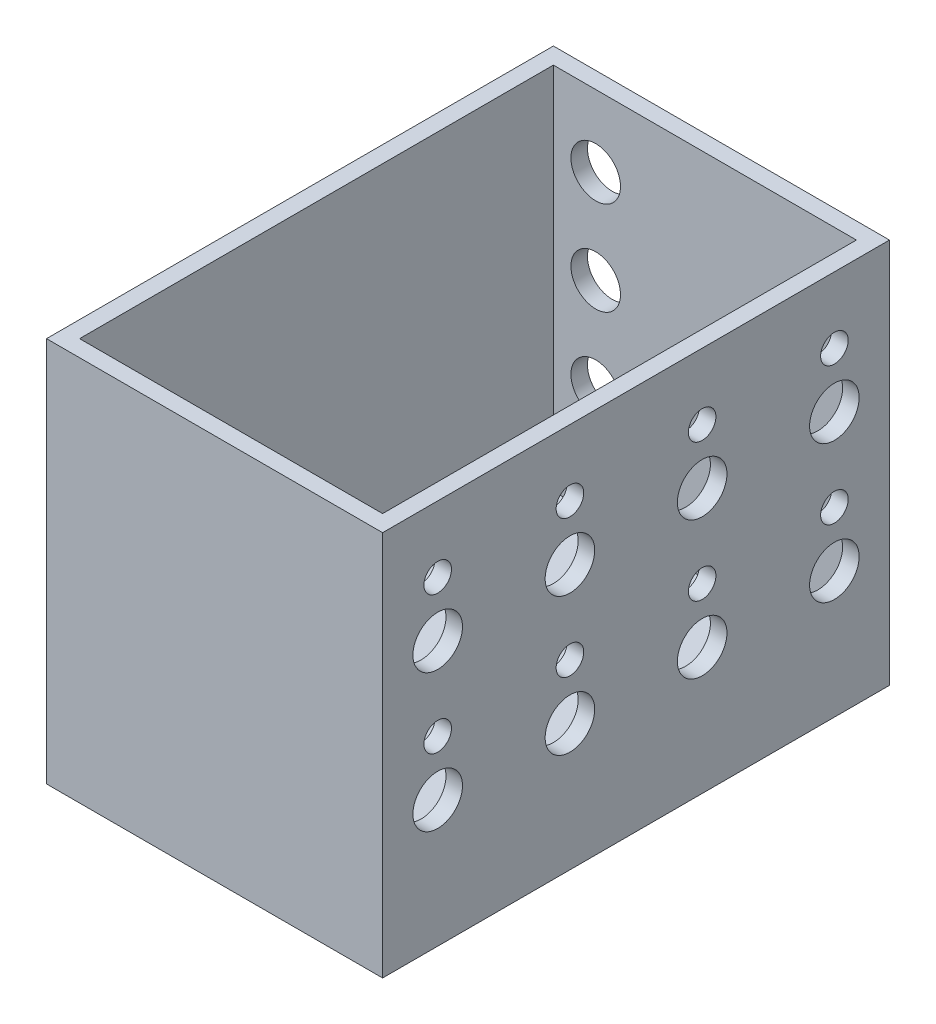
ISO-10303-21;
HEADER;
FILE_DESCRIPTION(('STEP AP214'),'2;1');
FILE_NAME('part.step','',(''),(''),'','','');
FILE_SCHEMA(('AUTOMOTIVE_DESIGN { 1 0 10303 214 1 1 1 1 }'));
ENDSEC;
DATA;
#1=APPLICATION_CONTEXT('core data for automotive mechanical design processes');
#2=APPLICATION_PROTOCOL_DEFINITION('international standard','automotive_design',2000,#1);
#3=PRODUCT_CONTEXT('',#1,'mechanical');
#4=PRODUCT('Part','Part','',(#3));
#5=PRODUCT_RELATED_PRODUCT_CATEGORY('part','',(#4));
#6=PRODUCT_DEFINITION_FORMATION('','',#4);
#7=PRODUCT_DEFINITION_CONTEXT('part definition',#1,'design');
#8=PRODUCT_DEFINITION('design','',#6,#7);
#9=PRODUCT_DEFINITION_SHAPE('','',#8);
#10=(LENGTH_UNIT() NAMED_UNIT(*) SI_UNIT(.MILLI.,.METRE.));
#11=(NAMED_UNIT(*) PLANE_ANGLE_UNIT() SI_UNIT($,.RADIAN.));
#12=(NAMED_UNIT(*) SI_UNIT($,.STERADIAN.) SOLID_ANGLE_UNIT());
#13=UNCERTAINTY_MEASURE_WITH_UNIT(LENGTH_MEASURE(1.E-05),#10,'distance_accuracy_value','');
#14=(GEOMETRIC_REPRESENTATION_CONTEXT(3) GLOBAL_UNCERTAINTY_ASSIGNED_CONTEXT((#13)) GLOBAL_UNIT_ASSIGNED_CONTEXT((#10,
#11,#12)) REPRESENTATION_CONTEXT('',''));
#15=CARTESIAN_POINT('',(0.,0.,0.));
#16=DIRECTION('',(0.,0.,1.));
#17=DIRECTION('',(1.,0.,0.));
#18=AXIS2_PLACEMENT_3D('',#15,#16,#17);
#19=CARTESIAN_POINT('',(0.,3.,0.));
#20=DIRECTION('',(0.,-1.,0.));
#21=DIRECTION('',(0.,0.,-1.));
#22=AXIS2_PLACEMENT_3D('',#19,#20,#21);
#23=PLANE('',#22);
#24=DIRECTION('',(-1.,0.,0.));
#25=VECTOR('',#24,1.);
#26=CARTESIAN_POINT('',(-22.5,3.,-22.5));
#27=LINE('',#26,#25);
#28=CARTESIAN_POINT('',(22.5,3.,-22.5));
#29=VERTEX_POINT('',#28);
#30=CARTESIAN_POINT('',(-22.5,3.,-22.5));
#31=VERTEX_POINT('',#30);
#32=EDGE_CURVE('E236',#29,#31,#27,.T.);
#33=ORIENTED_EDGE('',*,*,#32,.F.);
#34=DIRECTION('',(0.,0.,-1.));
#35=VECTOR('',#34,1.);
#36=CARTESIAN_POINT('',(22.5,3.,22.5));
#37=LINE('',#36,#35);
#38=CARTESIAN_POINT('',(22.5,3.,22.5));
#39=VERTEX_POINT('',#38);
#40=EDGE_CURVE('E59',#39,#29,#37,.T.);
#41=ORIENTED_EDGE('',*,*,#40,.F.);
#42=DIRECTION('',(1.,0.,0.));
#43=VECTOR('',#42,1.);
#44=CARTESIAN_POINT('',(-22.5,3.,22.5));
#45=LINE('',#44,#43);
#46=CARTESIAN_POINT('',(-22.5,3.,22.5));
#47=VERTEX_POINT('',#46);
#48=EDGE_CURVE('E221',#47,#39,#45,.T.);
#49=ORIENTED_EDGE('',*,*,#48,.F.);
#50=DIRECTION('',(0.,0.,1.));
#51=VECTOR('',#50,1.);
#52=CARTESIAN_POINT('',(-22.5,3.,22.5));
#53=LINE('',#52,#51);
#54=EDGE_CURVE('E240',#31,#47,#53,.T.);
#55=ORIENTED_EDGE('',*,*,#54,.F.);
#56=EDGE_LOOP('',(#33,#41,#49,#55));
#57=FACE_BOUND('',#56,.T.);
#58=DIRECTION('',(0.,0.,-1.));
#59=VECTOR('',#58,1.);
#60=CARTESIAN_POINT('',(27.5,3.,43.));
#61=LINE('',#60,#59);
#62=CARTESIAN_POINT('',(27.5,3.,43.));
#63=VERTEX_POINT('',#62);
#64=CARTESIAN_POINT('',(27.5,3.,-43.));
#65=VERTEX_POINT('',#64);
#66=EDGE_CURVE('E250',#63,#65,#61,.T.);
#67=ORIENTED_EDGE('',*,*,#66,.T.);
#68=DIRECTION('',(-1.,0.,0.));
#69=VECTOR('',#68,1.);
#70=CARTESIAN_POINT('',(-27.5,3.,-43.));
#71=LINE('',#70,#69);
#72=CARTESIAN_POINT('',(-27.5,3.,-43.));
#73=VERTEX_POINT('',#72);
#74=EDGE_CURVE('E262',#65,#73,#71,.T.);
#75=ORIENTED_EDGE('',*,*,#74,.T.);
#76=DIRECTION('',(0.,0.,1.));
#77=VECTOR('',#76,1.);
#78=CARTESIAN_POINT('',(-27.5,3.,43.));
#79=LINE('',#78,#77);
#80=CARTESIAN_POINT('',(-27.5,3.,43.));
#81=VERTEX_POINT('',#80);
#82=EDGE_CURVE('E52',#73,#81,#79,.T.);
#83=ORIENTED_EDGE('',*,*,#82,.T.);
#84=DIRECTION('',(1.,0.,0.));
#85=VECTOR('',#84,1.);
#86=CARTESIAN_POINT('',(-27.5,3.,43.));
#87=LINE('',#86,#85);
#88=EDGE_CURVE('E11',#81,#63,#87,.T.);
#89=ORIENTED_EDGE('',*,*,#88,.T.);
#90=EDGE_LOOP('',(#67,#75,#83,#89));
#91=FACE_BOUND('',#90,.T.);
#92=ADVANCED_FACE('F43',(#57,#91),#23,.F.);
#93=CARTESIAN_POINT('',(22.5,1.5,22.5));
#94=DIRECTION('',(1.,0.,0.));
#95=DIRECTION('',(0.,0.,-1.));
#96=AXIS2_PLACEMENT_3D('',#93,#94,#95);
#97=PLANE('',#96);
#98=ORIENTED_EDGE('',*,*,#40,.T.);
#99=DIRECTION('',(0.,1.,0.));
#100=VECTOR('',#99,1.);
#101=CARTESIAN_POINT('',(22.5,1.5,-22.5));
#102=LINE('',#101,#100);
#103=CARTESIAN_POINT('',(22.5,1.5,-22.5));
#104=VERTEX_POINT('',#103);
#105=EDGE_CURVE('E233',#104,#29,#102,.T.);
#106=ORIENTED_EDGE('',*,*,#105,.F.);
#107=DIRECTION('',(0.,0.,-1.));
#108=VECTOR('',#107,1.);
#109=CARTESIAN_POINT('',(22.5,1.5,22.5));
#110=LINE('',#109,#108);
#111=CARTESIAN_POINT('',(22.5,1.5,22.5));
#112=VERTEX_POINT('',#111);
#113=EDGE_CURVE('E216',#112,#104,#110,.T.);
#114=ORIENTED_EDGE('',*,*,#113,.F.);
#115=DIRECTION('',(0.,1.,0.));
#116=VECTOR('',#115,1.);
#117=CARTESIAN_POINT('',(22.5,1.5,22.5));
#118=LINE('',#117,#116);
#119=EDGE_CURVE('E247',#112,#39,#118,.T.);
#120=ORIENTED_EDGE('',*,*,#119,.T.);
#121=EDGE_LOOP('',(#98,#106,#114,#120));
#122=FACE_BOUND('',#121,.T.);
#123=ADVANCED_FACE('F279',(#122),#97,.F.);
#124=CARTESIAN_POINT('',(-22.5,1.5,22.5));
#125=DIRECTION('',(0.,0.,1.));
#126=DIRECTION('',(1.,0.,0.));
#127=AXIS2_PLACEMENT_3D('',#124,#125,#126);
#128=PLANE('',#127);
#129=ORIENTED_EDGE('',*,*,#48,.T.);
#130=ORIENTED_EDGE('',*,*,#119,.F.);
#131=DIRECTION('',(1.,0.,0.));
#132=VECTOR('',#131,1.);
#133=CARTESIAN_POINT('',(-22.5,1.5,22.5));
#134=LINE('',#133,#132);
#135=CARTESIAN_POINT('',(-22.5,1.5,22.5));
#136=VERTEX_POINT('',#135);
#137=EDGE_CURVE('E229',#136,#112,#134,.T.);
#138=ORIENTED_EDGE('',*,*,#137,.F.);
#139=DIRECTION('',(0.,1.,0.));
#140=VECTOR('',#139,1.);
#141=CARTESIAN_POINT('',(-22.5,1.5,22.5));
#142=LINE('',#141,#140);
#143=EDGE_CURVE('E251',#136,#47,#142,.T.);
#144=ORIENTED_EDGE('',*,*,#143,.T.);
#145=EDGE_LOOP('',(#129,#130,#138,#144));
#146=FACE_BOUND('',#145,.T.);
#147=ADVANCED_FACE('F284',(#146),#128,.F.);
#148=CARTESIAN_POINT('',(-22.5,1.5,22.5));
#149=DIRECTION('',(-1.,0.,0.));
#150=DIRECTION('',(0.,0.,1.));
#151=AXIS2_PLACEMENT_3D('',#148,#149,#150);
#152=PLANE('',#151);
#153=ORIENTED_EDGE('',*,*,#54,.T.);
#154=ORIENTED_EDGE('',*,*,#143,.F.);
#155=DIRECTION('',(0.,0.,1.));
#156=VECTOR('',#155,1.);
#157=CARTESIAN_POINT('',(-22.5,1.5,22.5));
#158=LINE('',#157,#156);
#159=CARTESIAN_POINT('',(-22.5,1.5,-22.5));
#160=VERTEX_POINT('',#159);
#161=EDGE_CURVE('E225',#160,#136,#158,.T.);
#162=ORIENTED_EDGE('',*,*,#161,.F.);
#163=DIRECTION('',(0.,1.,0.));
#164=VECTOR('',#163,1.);
#165=CARTESIAN_POINT('',(-22.5,1.5,-22.5));
#166=LINE('',#165,#164);
#167=EDGE_CURVE('E254',#160,#31,#166,.T.);
#168=ORIENTED_EDGE('',*,*,#167,.T.);
#169=EDGE_LOOP('',(#153,#154,#162,#168));
#170=FACE_BOUND('',#169,.T.);
#171=ADVANCED_FACE('F292',(#170),#152,.F.);
#172=CARTESIAN_POINT('',(-22.5,1.5,-22.5));
#173=DIRECTION('',(0.,0.,-1.));
#174=DIRECTION('',(-1.,0.,0.));
#175=AXIS2_PLACEMENT_3D('',#172,#173,#174);
#176=PLANE('',#175);
#177=ORIENTED_EDGE('',*,*,#32,.T.);
#178=ORIENTED_EDGE('',*,*,#167,.F.);
#179=DIRECTION('',(-1.,0.,0.));
#180=VECTOR('',#179,1.);
#181=CARTESIAN_POINT('',(-22.5,1.5,-22.5));
#182=LINE('',#181,#180);
#183=EDGE_CURVE('E220',#104,#160,#182,.T.);
#184=ORIENTED_EDGE('',*,*,#183,.F.);
#185=ORIENTED_EDGE('',*,*,#105,.T.);
#186=EDGE_LOOP('',(#177,#178,#184,#185));
#187=FACE_BOUND('',#186,.T.);
#188=ADVANCED_FACE('F288',(#187),#176,.F.);
#189=CARTESIAN_POINT('',(0.,1.5,0.));
#190=DIRECTION('',(0.,-1.,0.));
#191=DIRECTION('',(0.,0.,-1.));
#192=AXIS2_PLACEMENT_3D('',#189,#190,#191);
#193=PLANE('',#192);
#194=ORIENTED_EDGE('',*,*,#113,.T.);
#195=ORIENTED_EDGE('',*,*,#183,.T.);
#196=ORIENTED_EDGE('',*,*,#161,.T.);
#197=ORIENTED_EDGE('',*,*,#137,.T.);
#198=EDGE_LOOP('',(#194,#195,#196,#197));
#199=FACE_BOUND('',#198,.T.);
#200=ADVANCED_FACE('F291',(#199),#193,.F.);
#201=CARTESIAN_POINT('',(27.5,70.,-43.));
#202=DIRECTION('',(0.,0.,1.));
#203=DIRECTION('',(1.,0.,0.));
#204=AXIS2_PLACEMENT_3D('',#201,#202,#203);
#205=PLANE('',#204);
#206=CARTESIAN_POINT('',(-19.8186408341999,57.,-43.));
#207=DIRECTION('',(0.,0.,-1.));
#208=DIRECTION('',(-1.,0.,0.));
#209=AXIS2_PLACEMENT_3D('',#206,#207,#208);
#210=CIRCLE('',#209,4.5);
#211=CARTESIAN_POINT('',(-24.3186408341999,57.,-43.));
#212=VERTEX_POINT('',#211);
#213=EDGE_CURVE('E329',#212,#212,#210,.T.);
#214=ORIENTED_EDGE('',*,*,#213,.T.);
#215=EDGE_LOOP('',(#214));
#216=FACE_BOUND('',#215,.T.);
#217=CARTESIAN_POINT('',(-19.8186408341999,23.,-43.));
#218=DIRECTION('',(0.,0.,-1.));
#219=DIRECTION('',(-1.,0.,0.));
#220=AXIS2_PLACEMENT_3D('',#217,#218,#219);
#221=CIRCLE('',#220,4.5);
#222=CARTESIAN_POINT('',(-24.3186408341999,23.,-43.));
#223=VERTEX_POINT('',#222);
#224=EDGE_CURVE('E333',#223,#223,#221,.T.);
#225=ORIENTED_EDGE('',*,*,#224,.T.);
#226=EDGE_LOOP('',(#225));
#227=FACE_BOUND('',#226,.T.);
#228=CARTESIAN_POINT('',(-19.8186408341999,40.,-43.));
#229=DIRECTION('',(0.,0.,-1.));
#230=DIRECTION('',(-1.,0.,0.));
#231=AXIS2_PLACEMENT_3D('',#228,#229,#230);
#232=CIRCLE('',#231,4.5);
#233=CARTESIAN_POINT('',(-24.3186408341999,40.,-43.));
#234=VERTEX_POINT('',#233);
#235=EDGE_CURVE('E336',#234,#234,#232,.T.);
#236=ORIENTED_EDGE('',*,*,#235,.T.);
#237=EDGE_LOOP('',(#236));
#238=FACE_BOUND('',#237,.T.);
#239=ORIENTED_EDGE('',*,*,#74,.F.);
#240=DIRECTION('',(0.,-1.,0.));
#241=VECTOR('',#240,1.);
#242=CARTESIAN_POINT('',(27.5,70.,-43.));
#243=LINE('',#242,#241);
#244=CARTESIAN_POINT('',(27.5,70.,-43.));
#245=VERTEX_POINT('',#244);
#246=EDGE_CURVE('E67',#245,#65,#243,.T.);
#247=ORIENTED_EDGE('',*,*,#246,.F.);
#248=DIRECTION('',(-1.,0.,0.));
#249=VECTOR('',#248,1.);
#250=CARTESIAN_POINT('',(27.5,70.,-43.));
#251=LINE('',#250,#249);
#252=CARTESIAN_POINT('',(-27.5,70.,-43.));
#253=VERTEX_POINT('',#252);
#254=EDGE_CURVE('E133',#245,#253,#251,.T.);
#255=ORIENTED_EDGE('',*,*,#254,.T.);
#256=DIRECTION('',(0.,-1.,0.));
#257=VECTOR('',#256,1.);
#258=CARTESIAN_POINT('',(-27.5,70.,-43.));
#259=LINE('',#258,#257);
#260=EDGE_CURVE('E136',#253,#73,#259,.T.);
#261=ORIENTED_EDGE('',*,*,#260,.T.);
#262=EDGE_LOOP('',(#239,#247,#255,#261));
#263=FACE_BOUND('',#262,.T.);
#264=ADVANCED_FACE('F135',(#216,#227,#238,#263),#205,.T.);
#265=CARTESIAN_POINT('',(-27.5,70.,-43.));
#266=DIRECTION('',(1.,0.,0.));
#267=DIRECTION('',(0.,0.,-1.));
#268=AXIS2_PLACEMENT_3D('',#265,#266,#267);
#269=PLANE('',#268);
#270=ORIENTED_EDGE('',*,*,#82,.F.);
#271=ORIENTED_EDGE('',*,*,#260,.F.);
#272=DIRECTION('',(0.,0.,1.));
#273=VECTOR('',#272,1.);
#274=CARTESIAN_POINT('',(-27.5,70.,-43.));
#275=LINE('',#274,#273);
#276=CARTESIAN_POINT('',(-27.5,70.,43.));
#277=VERTEX_POINT('',#276);
#278=EDGE_CURVE('E142',#253,#277,#275,.T.);
#279=ORIENTED_EDGE('',*,*,#278,.T.);
#280=DIRECTION('',(0.,-1.,0.));
#281=VECTOR('',#280,1.);
#282=CARTESIAN_POINT('',(-27.5,70.,43.));
#283=LINE('',#282,#281);
#284=EDGE_CURVE('E152',#277,#81,#283,.T.);
#285=ORIENTED_EDGE('',*,*,#284,.T.);
#286=EDGE_LOOP('',(#270,#271,#279,#285));
#287=FACE_BOUND('',#286,.T.);
#288=ADVANCED_FACE('F146',(#287),#269,.T.);
#289=CARTESIAN_POINT('',(-27.5,70.,43.));
#290=DIRECTION('',(0.,0.,-1.));
#291=DIRECTION('',(-1.,0.,0.));
#292=AXIS2_PLACEMENT_3D('',#289,#290,#291);
#293=PLANE('',#292);
#294=ORIENTED_EDGE('',*,*,#88,.F.);
#295=ORIENTED_EDGE('',*,*,#284,.F.);
#296=DIRECTION('',(1.,0.,0.));
#297=VECTOR('',#296,1.);
#298=CARTESIAN_POINT('',(-27.5,70.,43.));
#299=LINE('',#298,#297);
#300=CARTESIAN_POINT('',(27.5,70.,43.));
#301=VERTEX_POINT('',#300);
#302=EDGE_CURVE('E157',#277,#301,#299,.T.);
#303=ORIENTED_EDGE('',*,*,#302,.T.);
#304=DIRECTION('',(0.,-1.,0.));
#305=VECTOR('',#304,1.);
#306=CARTESIAN_POINT('',(27.5,70.,43.));
#307=LINE('',#306,#305);
#308=EDGE_CURVE('E169',#301,#63,#307,.T.);
#309=ORIENTED_EDGE('',*,*,#308,.T.);
#310=EDGE_LOOP('',(#294,#295,#303,#309));
#311=FACE_BOUND('',#310,.T.);
#312=ADVANCED_FACE('F268',(#311),#293,.T.);
#313=CARTESIAN_POINT('',(27.5,70.,43.));
#314=DIRECTION('',(-1.,0.,0.));
#315=DIRECTION('',(0.,0.,1.));
#316=AXIS2_PLACEMENT_3D('',#313,#314,#315);
#317=PLANE('',#316);
#318=CARTESIAN_POINT('',(27.5,33.,36.));
#319=DIRECTION('',(1.,0.,0.));
#320=DIRECTION('',(0.,0.,-1.));
#321=AXIS2_PLACEMENT_3D('',#318,#319,#320);
#322=CIRCLE('',#321,2.5);
#323=CARTESIAN_POINT('',(27.5,33.,33.5));
#324=VERTEX_POINT('',#323);
#325=EDGE_CURVE('E377',#324,#324,#322,.T.);
#326=ORIENTED_EDGE('',*,*,#325,.T.);
#327=EDGE_LOOP('',(#326));
#328=FACE_BOUND('',#327,.T.);
#329=CARTESIAN_POINT('',(27.5,23.,36.));
#330=DIRECTION('',(1.,0.,0.));
#331=DIRECTION('',(0.,0.,-1.));
#332=AXIS2_PLACEMENT_3D('',#329,#330,#331);
#333=CIRCLE('',#332,4.5);
#334=CARTESIAN_POINT('',(27.5,23.,31.5));
#335=VERTEX_POINT('',#334);
#336=EDGE_CURVE('E426',#335,#335,#333,.T.);
#337=ORIENTED_EDGE('',*,*,#336,.T.);
#338=EDGE_LOOP('',(#337));
#339=FACE_BOUND('',#338,.T.);
#340=CARTESIAN_POINT('',(27.5,23.,12.));
#341=DIRECTION('',(1.,0.,0.));
#342=DIRECTION('',(0.,0.,-1.));
#343=AXIS2_PLACEMENT_3D('',#340,#341,#342);
#344=CIRCLE('',#343,4.5);
#345=CARTESIAN_POINT('',(27.5,23.,7.5));
#346=VERTEX_POINT('',#345);
#347=EDGE_CURVE('E418',#346,#346,#344,.T.);
#348=ORIENTED_EDGE('',*,*,#347,.T.);
#349=EDGE_LOOP('',(#348));
#350=FACE_BOUND('',#349,.T.);
#351=CARTESIAN_POINT('',(27.5,23.,-12.));
#352=DIRECTION('',(1.,0.,0.));
#353=DIRECTION('',(0.,0.,-1.));
#354=AXIS2_PLACEMENT_3D('',#351,#352,#353);
#355=CIRCLE('',#354,4.5);
#356=CARTESIAN_POINT('',(27.5,23.,-16.5));
#357=VERTEX_POINT('',#356);
#358=EDGE_CURVE('E410',#357,#357,#355,.T.);
#359=ORIENTED_EDGE('',*,*,#358,.T.);
#360=EDGE_LOOP('',(#359));
#361=FACE_BOUND('',#360,.T.);
#362=CARTESIAN_POINT('',(27.5,23.,-36.));
#363=DIRECTION('',(1.,0.,0.));
#364=DIRECTION('',(0.,0.,-1.));
#365=AXIS2_PLACEMENT_3D('',#362,#363,#364);
#366=CIRCLE('',#365,4.5);
#367=CARTESIAN_POINT('',(27.5,23.,-40.5));
#368=VERTEX_POINT('',#367);
#369=EDGE_CURVE('E409',#368,#368,#366,.T.);
#370=ORIENTED_EDGE('',*,*,#369,.T.);
#371=EDGE_LOOP('',(#370));
#372=FACE_BOUND('',#371,.T.);
#373=CARTESIAN_POINT('',(27.5,48.,-36.));
#374=DIRECTION('',(1.,0.,0.));
#375=DIRECTION('',(0.,0.,-1.));
#376=AXIS2_PLACEMENT_3D('',#373,#374,#375);
#377=CIRCLE('',#376,4.5);
#378=CARTESIAN_POINT('',(27.5,48.,-40.5));
#379=VERTEX_POINT('',#378);
#380=EDGE_CURVE('E458',#379,#379,#377,.T.);
#381=ORIENTED_EDGE('',*,*,#380,.T.);
#382=EDGE_LOOP('',(#381));
#383=FACE_BOUND('',#382,.T.);
#384=CARTESIAN_POINT('',(27.5,48.,-12.));
#385=DIRECTION('',(1.,0.,0.));
#386=DIRECTION('',(0.,0.,-1.));
#387=AXIS2_PLACEMENT_3D('',#384,#385,#386);
#388=CIRCLE('',#387,4.5);
#389=CARTESIAN_POINT('',(27.5,48.,-16.5));
#390=VERTEX_POINT('',#389);
#391=EDGE_CURVE('E450',#390,#390,#388,.T.);
#392=ORIENTED_EDGE('',*,*,#391,.T.);
#393=EDGE_LOOP('',(#392));
#394=FACE_BOUND('',#393,.T.);
#395=CARTESIAN_POINT('',(27.5,48.,12.));
#396=DIRECTION('',(1.,0.,0.));
#397=DIRECTION('',(0.,0.,-1.));
#398=AXIS2_PLACEMENT_3D('',#395,#396,#397);
#399=CIRCLE('',#398,4.5);
#400=CARTESIAN_POINT('',(27.5,48.,7.5));
#401=VERTEX_POINT('',#400);
#402=EDGE_CURVE('E442',#401,#401,#399,.T.);
#403=ORIENTED_EDGE('',*,*,#402,.T.);
#404=EDGE_LOOP('',(#403));
#405=FACE_BOUND('',#404,.T.);
#406=CARTESIAN_POINT('',(27.5,58.,36.));
#407=DIRECTION('',(1.,0.,0.));
#408=DIRECTION('',(0.,0.,-1.));
#409=AXIS2_PLACEMENT_3D('',#406,#407,#408);
#410=CIRCLE('',#409,2.5);
#411=CARTESIAN_POINT('',(27.5,58.,33.5));
#412=VERTEX_POINT('',#411);
#413=EDGE_CURVE('E339',#412,#412,#410,.T.);
#414=ORIENTED_EDGE('',*,*,#413,.T.);
#415=EDGE_LOOP('',(#414));
#416=FACE_BOUND('',#415,.T.);
#417=CARTESIAN_POINT('',(27.5,58.,12.));
#418=DIRECTION('',(1.,0.,0.));
#419=DIRECTION('',(0.,0.,-1.));
#420=AXIS2_PLACEMENT_3D('',#417,#418,#419);
#421=CIRCLE('',#420,2.5);
#422=CARTESIAN_POINT('',(27.5,58.,9.5));
#423=VERTEX_POINT('',#422);
#424=EDGE_CURVE('E366',#423,#423,#421,.T.);
#425=ORIENTED_EDGE('',*,*,#424,.T.);
#426=EDGE_LOOP('',(#425));
#427=FACE_BOUND('',#426,.T.);
#428=CARTESIAN_POINT('',(27.5,58.,-12.));
#429=DIRECTION('',(1.,0.,0.));
#430=DIRECTION('',(0.,0.,-1.));
#431=AXIS2_PLACEMENT_3D('',#428,#429,#430);
#432=CIRCLE('',#431,2.5);
#433=CARTESIAN_POINT('',(27.5,58.,-14.5));
#434=VERTEX_POINT('',#433);
#435=EDGE_CURVE('E358',#434,#434,#432,.T.);
#436=ORIENTED_EDGE('',*,*,#435,.T.);
#437=EDGE_LOOP('',(#436));
#438=FACE_BOUND('',#437,.T.);
#439=CARTESIAN_POINT('',(27.5,58.,-36.));
#440=DIRECTION('',(1.,0.,0.));
#441=DIRECTION('',(0.,0.,-1.));
#442=AXIS2_PLACEMENT_3D('',#439,#440,#441);
#443=CIRCLE('',#442,2.5);
#444=CARTESIAN_POINT('',(27.5,58.,-38.5));
#445=VERTEX_POINT('',#444);
#446=EDGE_CURVE('E357',#445,#445,#443,.T.);
#447=ORIENTED_EDGE('',*,*,#446,.T.);
#448=EDGE_LOOP('',(#447));
#449=FACE_BOUND('',#448,.T.);
#450=CARTESIAN_POINT('',(27.5,33.,-36.));
#451=DIRECTION('',(1.,0.,0.));
#452=DIRECTION('',(0.,0.,-1.));
#453=AXIS2_PLACEMENT_3D('',#450,#451,#452);
#454=CIRCLE('',#453,2.5);
#455=CARTESIAN_POINT('',(27.5,33.,-38.5));
#456=VERTEX_POINT('',#455);
#457=EDGE_CURVE('E394',#456,#456,#454,.T.);
#458=ORIENTED_EDGE('',*,*,#457,.T.);
#459=EDGE_LOOP('',(#458));
#460=FACE_BOUND('',#459,.T.);
#461=CARTESIAN_POINT('',(27.5,33.,-12.));
#462=DIRECTION('',(1.,0.,0.));
#463=DIRECTION('',(0.,0.,-1.));
#464=AXIS2_PLACEMENT_3D('',#461,#462,#463);
#465=CIRCLE('',#464,2.5);
#466=CARTESIAN_POINT('',(27.5,33.,-14.5));
#467=VERTEX_POINT('',#466);
#468=EDGE_CURVE('E386',#467,#467,#465,.T.);
#469=ORIENTED_EDGE('',*,*,#468,.T.);
#470=EDGE_LOOP('',(#469));
#471=FACE_BOUND('',#470,.T.);
#472=CARTESIAN_POINT('',(27.5,33.,12.));
#473=DIRECTION('',(1.,0.,0.));
#474=DIRECTION('',(0.,0.,-1.));
#475=AXIS2_PLACEMENT_3D('',#472,#473,#474);
#476=CIRCLE('',#475,2.5);
#477=CARTESIAN_POINT('',(27.5,33.,9.5));
#478=VERTEX_POINT('',#477);
#479=EDGE_CURVE('E378',#478,#478,#476,.T.);
#480=ORIENTED_EDGE('',*,*,#479,.T.);
#481=EDGE_LOOP('',(#480));
#482=FACE_BOUND('',#481,.T.);
#483=CARTESIAN_POINT('',(27.5,48.,36.));
#484=DIRECTION('',(1.,0.,0.));
#485=DIRECTION('',(0.,0.,-1.));
#486=AXIS2_PLACEMENT_3D('',#483,#484,#485);
#487=CIRCLE('',#486,4.5);
#488=CARTESIAN_POINT('',(27.5,48.,31.5));
#489=VERTEX_POINT('',#488);
#490=EDGE_CURVE('E143',#489,#489,#487,.T.);
#491=ORIENTED_EDGE('',*,*,#490,.T.);
#492=EDGE_LOOP('',(#491));
#493=FACE_BOUND('',#492,.T.);
#494=ORIENTED_EDGE('',*,*,#66,.F.);
#495=ORIENTED_EDGE('',*,*,#308,.F.);
#496=DIRECTION('',(0.,0.,-1.));
#497=VECTOR('',#496,1.);
#498=CARTESIAN_POINT('',(27.5,70.,43.));
#499=LINE('',#498,#497);
#500=EDGE_CURVE('E161',#301,#245,#499,.T.);
#501=ORIENTED_EDGE('',*,*,#500,.T.);
#502=ORIENTED_EDGE('',*,*,#246,.T.);
#503=EDGE_LOOP('',(#494,#495,#501,#502));
#504=FACE_BOUND('',#503,.T.);
#505=ADVANCED_FACE('F266',(#328,#339,#350,#361,#372,#383,#394,#405,#416,#427,#438,#449,#460,
#471,#482,#493,#504),#317,.T.);
#506=CARTESIAN_POINT('',(0.,70.,0.));
#507=DIRECTION('',(0.,1.,0.));
#508=DIRECTION('',(0.,0.,1.));
#509=AXIS2_PLACEMENT_3D('',#506,#507,#508);
#510=PLANE('',#509);
#511=DIRECTION('',(-1.,0.,0.));
#512=VECTOR('',#511,1.);
#513=CARTESIAN_POINT('',(30.5,70.,-46.));
#514=LINE('',#513,#512);
#515=CARTESIAN_POINT('',(30.5,70.,-46.));
#516=VERTEX_POINT('',#515);
#517=CARTESIAN_POINT('',(-30.5,70.,-46.));
#518=VERTEX_POINT('',#517);
#519=EDGE_CURVE('E175',#516,#518,#514,.T.);
#520=ORIENTED_EDGE('',*,*,#519,.T.);
#521=DIRECTION('',(0.,0.,1.));
#522=VECTOR('',#521,1.);
#523=CARTESIAN_POINT('',(-30.5,70.,-46.));
#524=LINE('',#523,#522);
#525=CARTESIAN_POINT('',(-30.5,70.,46.));
#526=VERTEX_POINT('',#525);
#527=EDGE_CURVE('E179',#518,#526,#524,.T.);
#528=ORIENTED_EDGE('',*,*,#527,.T.);
#529=DIRECTION('',(1.,0.,0.));
#530=VECTOR('',#529,1.);
#531=CARTESIAN_POINT('',(-30.5,70.,46.));
#532=LINE('',#531,#530);
#533=CARTESIAN_POINT('',(30.5,70.,46.));
#534=VERTEX_POINT('',#533);
#535=EDGE_CURVE('E183',#526,#534,#532,.T.);
#536=ORIENTED_EDGE('',*,*,#535,.T.);
#537=DIRECTION('',(0.,0.,-1.));
#538=VECTOR('',#537,1.);
#539=CARTESIAN_POINT('',(30.5,70.,46.));
#540=LINE('',#539,#538);
#541=EDGE_CURVE('E186',#534,#516,#540,.T.);
#542=ORIENTED_EDGE('',*,*,#541,.T.);
#543=EDGE_LOOP('',(#520,#528,#536,#542));
#544=FACE_BOUND('',#543,.T.);
#545=ORIENTED_EDGE('',*,*,#278,.F.);
#546=ORIENTED_EDGE('',*,*,#254,.F.);
#547=ORIENTED_EDGE('',*,*,#500,.F.);
#548=ORIENTED_EDGE('',*,*,#302,.F.);
#549=EDGE_LOOP('',(#545,#546,#547,#548));
#550=FACE_BOUND('',#549,.T.);
#551=ADVANCED_FACE('F155',(#544,#550),#510,.T.);
#552=CARTESIAN_POINT('',(30.5,70.,-46.));
#553=DIRECTION('',(0.,0.,1.));
#554=DIRECTION('',(1.,0.,0.));
#555=AXIS2_PLACEMENT_3D('',#552,#553,#554);
#556=PLANE('',#555);
#557=CARTESIAN_POINT('',(-19.8186408341999,57.,-46.));
#558=DIRECTION('',(0.,0.,-1.));
#559=DIRECTION('',(-1.,0.,0.));
#560=AXIS2_PLACEMENT_3D('',#557,#558,#559);
#561=CIRCLE('',#560,4.5);
#562=CARTESIAN_POINT('',(-24.3186408341999,57.,-46.));
#563=VERTEX_POINT('',#562);
#564=EDGE_CURVE('E579',#563,#563,#561,.T.);
#565=ORIENTED_EDGE('',*,*,#564,.F.);
#566=EDGE_LOOP('',(#565));
#567=FACE_BOUND('',#566,.T.);
#568=CARTESIAN_POINT('',(-19.8186408341999,23.,-46.));
#569=DIRECTION('',(0.,0.,-1.));
#570=DIRECTION('',(-1.,0.,0.));
#571=AXIS2_PLACEMENT_3D('',#568,#569,#570);
#572=CIRCLE('',#571,4.5);
#573=CARTESIAN_POINT('',(-24.3186408341999,23.,-46.));
#574=VERTEX_POINT('',#573);
#575=EDGE_CURVE('E348',#574,#574,#572,.T.);
#576=ORIENTED_EDGE('',*,*,#575,.F.);
#577=EDGE_LOOP('',(#576));
#578=FACE_BOUND('',#577,.T.);
#579=CARTESIAN_POINT('',(-19.8186408341999,40.,-46.));
#580=DIRECTION('',(0.,0.,-1.));
#581=DIRECTION('',(-1.,0.,0.));
#582=AXIS2_PLACEMENT_3D('',#579,#580,#581);
#583=CIRCLE('',#582,4.5);
#584=CARTESIAN_POINT('',(-24.3186408341999,40.,-46.));
#585=VERTEX_POINT('',#584);
#586=EDGE_CURVE('E340',#585,#585,#583,.T.);
#587=ORIENTED_EDGE('',*,*,#586,.F.);
#588=EDGE_LOOP('',(#587));
#589=FACE_BOUND('',#588,.T.);
#590=DIRECTION('',(-1.,0.,0.));
#591=VECTOR('',#590,1.);
#592=CARTESIAN_POINT('',(30.5,0.,-46.));
#593=LINE('',#592,#591);
#594=CARTESIAN_POINT('',(30.5,0.,-46.));
#595=VERTEX_POINT('',#594);
#596=CARTESIAN_POINT('',(-30.5,0.,-46.));
#597=VERTEX_POINT('',#596);
#598=EDGE_CURVE('E151',#595,#597,#593,.T.);
#599=ORIENTED_EDGE('',*,*,#598,.T.);
#600=DIRECTION('',(0.,-1.,0.));
#601=VECTOR('',#600,1.);
#602=CARTESIAN_POINT('',(-30.5,70.,-46.));
#603=LINE('',#602,#601);
#604=EDGE_CURVE('E212',#518,#597,#603,.T.);
#605=ORIENTED_EDGE('',*,*,#604,.F.);
#606=ORIENTED_EDGE('',*,*,#519,.F.);
#607=DIRECTION('',(0.,-1.,0.));
#608=VECTOR('',#607,1.);
#609=CARTESIAN_POINT('',(30.5,70.,-46.));
#610=LINE('',#609,#608);
#611=EDGE_CURVE('E189',#516,#595,#610,.T.);
#612=ORIENTED_EDGE('',*,*,#611,.T.);
#613=EDGE_LOOP('',(#599,#605,#606,#612));
#614=FACE_BOUND('',#613,.T.);
#615=ADVANCED_FACE('F303',(#567,#578,#589,#614),#556,.F.);
#616=CARTESIAN_POINT('',(-30.5,70.,-46.));
#617=DIRECTION('',(1.,0.,0.));
#618=DIRECTION('',(0.,0.,-1.));
#619=AXIS2_PLACEMENT_3D('',#616,#617,#618);
#620=PLANE('',#619);
#621=DIRECTION('',(0.,0.,1.));
#622=VECTOR('',#621,1.);
#623=CARTESIAN_POINT('',(-30.5,0.,-46.));
#624=LINE('',#623,#622);
#625=CARTESIAN_POINT('',(-30.5,0.,46.));
#626=VERTEX_POINT('',#625);
#627=EDGE_CURVE('E193',#597,#626,#624,.T.);
#628=ORIENTED_EDGE('',*,*,#627,.T.);
#629=DIRECTION('',(0.,-1.,0.));
#630=VECTOR('',#629,1.);
#631=CARTESIAN_POINT('',(-30.5,70.,46.));
#632=LINE('',#631,#630);
#633=EDGE_CURVE('E208',#526,#626,#632,.T.);
#634=ORIENTED_EDGE('',*,*,#633,.F.);
#635=ORIENTED_EDGE('',*,*,#527,.F.);
#636=ORIENTED_EDGE('',*,*,#604,.T.);
#637=EDGE_LOOP('',(#628,#634,#635,#636));
#638=FACE_BOUND('',#637,.T.);
#639=ADVANCED_FACE('F306',(#638),#620,.F.);
#640=CARTESIAN_POINT('',(-30.5,70.,46.));
#641=DIRECTION('',(0.,0.,-1.));
#642=DIRECTION('',(-1.,0.,0.));
#643=AXIS2_PLACEMENT_3D('',#640,#641,#642);
#644=PLANE('',#643);
#645=DIRECTION('',(1.,0.,0.));
#646=VECTOR('',#645,1.);
#647=CARTESIAN_POINT('',(-30.5,0.,46.));
#648=LINE('',#647,#646);
#649=CARTESIAN_POINT('',(30.5,0.,46.));
#650=VERTEX_POINT('',#649);
#651=EDGE_CURVE('E196',#626,#650,#648,.T.);
#652=ORIENTED_EDGE('',*,*,#651,.T.);
#653=DIRECTION('',(0.,-1.,0.));
#654=VECTOR('',#653,1.);
#655=CARTESIAN_POINT('',(30.5,70.,46.));
#656=LINE('',#655,#654);
#657=EDGE_CURVE('E204',#534,#650,#656,.T.);
#658=ORIENTED_EDGE('',*,*,#657,.F.);
#659=ORIENTED_EDGE('',*,*,#535,.F.);
#660=ORIENTED_EDGE('',*,*,#633,.T.);
#661=EDGE_LOOP('',(#652,#658,#659,#660));
#662=FACE_BOUND('',#661,.T.);
#663=ADVANCED_FACE('F310',(#662),#644,.F.);
#664=CARTESIAN_POINT('',(30.5,70.,46.));
#665=DIRECTION('',(-1.,0.,0.));
#666=DIRECTION('',(0.,0.,1.));
#667=AXIS2_PLACEMENT_3D('',#664,#665,#666);
#668=PLANE('',#667);
#669=CARTESIAN_POINT('',(30.5,33.,36.));
#670=DIRECTION('',(1.,0.,0.));
#671=DIRECTION('',(0.,0.,-1.));
#672=AXIS2_PLACEMENT_3D('',#669,#670,#671);
#673=CIRCLE('',#672,2.5);
#674=CARTESIAN_POINT('',(30.5,33.,33.5));
#675=VERTEX_POINT('',#674);
#676=EDGE_CURVE('E430',#675,#675,#673,.T.);
#677=ORIENTED_EDGE('',*,*,#676,.F.);
#678=EDGE_LOOP('',(#677));
#679=FACE_BOUND('',#678,.T.);
#680=CARTESIAN_POINT('',(30.5,23.,36.));
#681=DIRECTION('',(1.,0.,0.));
#682=DIRECTION('',(0.,0.,-1.));
#683=AXIS2_PLACEMENT_3D('',#680,#681,#682);
#684=CIRCLE('',#683,4.5);
#685=CARTESIAN_POINT('',(30.5,23.,31.5));
#686=VERTEX_POINT('',#685);
#687=EDGE_CURVE('E422',#686,#686,#684,.T.);
#688=ORIENTED_EDGE('',*,*,#687,.F.);
#689=EDGE_LOOP('',(#688));
#690=FACE_BOUND('',#689,.T.);
#691=CARTESIAN_POINT('',(30.5,23.,12.));
#692=DIRECTION('',(1.,0.,0.));
#693=DIRECTION('',(0.,0.,-1.));
#694=AXIS2_PLACEMENT_3D('',#691,#692,#693);
#695=CIRCLE('',#694,4.5);
#696=CARTESIAN_POINT('',(30.5,23.,7.5));
#697=VERTEX_POINT('',#696);
#698=EDGE_CURVE('E414',#697,#697,#695,.T.);
#699=ORIENTED_EDGE('',*,*,#698,.F.);
#700=EDGE_LOOP('',(#699));
#701=FACE_BOUND('',#700,.T.);
#702=CARTESIAN_POINT('',(30.5,23.,-12.));
#703=DIRECTION('',(1.,0.,0.));
#704=DIRECTION('',(0.,0.,-1.));
#705=AXIS2_PLACEMENT_3D('',#702,#703,#704);
#706=CIRCLE('',#705,4.5);
#707=CARTESIAN_POINT('',(30.5,23.,-16.5));
#708=VERTEX_POINT('',#707);
#709=EDGE_CURVE('E405',#708,#708,#706,.T.);
#710=ORIENTED_EDGE('',*,*,#709,.F.);
#711=EDGE_LOOP('',(#710));
#712=FACE_BOUND('',#711,.T.);
#713=CARTESIAN_POINT('',(30.5,23.,-36.));
#714=DIRECTION('',(1.,0.,0.));
#715=DIRECTION('',(0.,0.,-1.));
#716=AXIS2_PLACEMENT_3D('',#713,#714,#715);
#717=CIRCLE('',#716,4.5);
#718=CARTESIAN_POINT('',(30.5,23.,-40.5));
#719=VERTEX_POINT('',#718);
#720=EDGE_CURVE('E462',#719,#719,#717,.T.);
#721=ORIENTED_EDGE('',*,*,#720,.F.);
#722=EDGE_LOOP('',(#721));
#723=FACE_BOUND('',#722,.T.);
#724=CARTESIAN_POINT('',(30.5,48.,-36.));
#725=DIRECTION('',(1.,0.,0.));
#726=DIRECTION('',(0.,0.,-1.));
#727=AXIS2_PLACEMENT_3D('',#724,#725,#726);
#728=CIRCLE('',#727,4.5);
#729=CARTESIAN_POINT('',(30.5,48.,-40.5));
#730=VERTEX_POINT('',#729);
#731=EDGE_CURVE('E454',#730,#730,#728,.T.);
#732=ORIENTED_EDGE('',*,*,#731,.F.);
#733=EDGE_LOOP('',(#732));
#734=FACE_BOUND('',#733,.T.);
#735=CARTESIAN_POINT('',(30.5,48.,-12.));
#736=DIRECTION('',(1.,0.,0.));
#737=DIRECTION('',(0.,0.,-1.));
#738=AXIS2_PLACEMENT_3D('',#735,#736,#737);
#739=CIRCLE('',#738,4.5);
#740=CARTESIAN_POINT('',(30.5,48.,-16.5));
#741=VERTEX_POINT('',#740);
#742=EDGE_CURVE('E446',#741,#741,#739,.T.);
#743=ORIENTED_EDGE('',*,*,#742,.F.);
#744=EDGE_LOOP('',(#743));
#745=FACE_BOUND('',#744,.T.);
#746=CARTESIAN_POINT('',(30.5,48.,12.));
#747=DIRECTION('',(1.,0.,0.));
#748=DIRECTION('',(0.,0.,-1.));
#749=AXIS2_PLACEMENT_3D('',#746,#747,#748);
#750=CIRCLE('',#749,4.5);
#751=CARTESIAN_POINT('',(30.5,48.,7.5));
#752=VERTEX_POINT('',#751);
#753=EDGE_CURVE('E437',#752,#752,#750,.T.);
#754=ORIENTED_EDGE('',*,*,#753,.F.);
#755=EDGE_LOOP('',(#754));
#756=FACE_BOUND('',#755,.T.);
#757=CARTESIAN_POINT('',(30.5,58.,36.));
#758=DIRECTION('',(1.,0.,0.));
#759=DIRECTION('',(0.,0.,-1.));
#760=AXIS2_PLACEMENT_3D('',#757,#758,#759);
#761=CIRCLE('',#760,2.5);
#762=CARTESIAN_POINT('',(30.5,58.,33.5));
#763=VERTEX_POINT('',#762);
#764=EDGE_CURVE('E345',#763,#763,#761,.T.);
#765=ORIENTED_EDGE('',*,*,#764,.F.);
#766=EDGE_LOOP('',(#765));
#767=FACE_BOUND('',#766,.T.);
#768=CARTESIAN_POINT('',(30.5,58.,12.));
#769=DIRECTION('',(1.,0.,0.));
#770=DIRECTION('',(0.,0.,-1.));
#771=AXIS2_PLACEMENT_3D('',#768,#769,#770);
#772=CIRCLE('',#771,2.5);
#773=CARTESIAN_POINT('',(30.5,58.,9.5));
#774=VERTEX_POINT('',#773);
#775=EDGE_CURVE('E362',#774,#774,#772,.T.);
#776=ORIENTED_EDGE('',*,*,#775,.F.);
#777=EDGE_LOOP('',(#776));
#778=FACE_BOUND('',#777,.T.);
#779=CARTESIAN_POINT('',(30.5,58.,-12.));
#780=DIRECTION('',(1.,0.,0.));
#781=DIRECTION('',(0.,0.,-1.));
#782=AXIS2_PLACEMENT_3D('',#779,#780,#781);
#783=CIRCLE('',#782,2.5);
#784=CARTESIAN_POINT('',(30.5,58.,-14.5));
#785=VERTEX_POINT('',#784);
#786=EDGE_CURVE('E353',#785,#785,#783,.T.);
#787=ORIENTED_EDGE('',*,*,#786,.F.);
#788=EDGE_LOOP('',(#787));
#789=FACE_BOUND('',#788,.T.);
#790=CARTESIAN_POINT('',(30.5,58.,-36.));
#791=DIRECTION('',(1.,0.,0.));
#792=DIRECTION('',(0.,0.,-1.));
#793=AXIS2_PLACEMENT_3D('',#790,#791,#792);
#794=CIRCLE('',#793,2.5);
#795=CARTESIAN_POINT('',(30.5,58.,-38.5));
#796=VERTEX_POINT('',#795);
#797=EDGE_CURVE('E398',#796,#796,#794,.T.);
#798=ORIENTED_EDGE('',*,*,#797,.F.);
#799=EDGE_LOOP('',(#798));
#800=FACE_BOUND('',#799,.T.);
#801=CARTESIAN_POINT('',(30.5,33.,-36.));
#802=DIRECTION('',(1.,0.,0.));
#803=DIRECTION('',(0.,0.,-1.));
#804=AXIS2_PLACEMENT_3D('',#801,#802,#803);
#805=CIRCLE('',#804,2.5);
#806=CARTESIAN_POINT('',(30.5,33.,-38.5));
#807=VERTEX_POINT('',#806);
#808=EDGE_CURVE('E390',#807,#807,#805,.T.);
#809=ORIENTED_EDGE('',*,*,#808,.F.);
#810=EDGE_LOOP('',(#809));
#811=FACE_BOUND('',#810,.T.);
#812=CARTESIAN_POINT('',(30.5,33.,-12.));
#813=DIRECTION('',(1.,0.,0.));
#814=DIRECTION('',(0.,0.,-1.));
#815=AXIS2_PLACEMENT_3D('',#812,#813,#814);
#816=CIRCLE('',#815,2.5);
#817=CARTESIAN_POINT('',(30.5,33.,-14.5));
#818=VERTEX_POINT('',#817);
#819=EDGE_CURVE('E382',#818,#818,#816,.T.);
#820=ORIENTED_EDGE('',*,*,#819,.F.);
#821=EDGE_LOOP('',(#820));
#822=FACE_BOUND('',#821,.T.);
#823=CARTESIAN_POINT('',(30.5,33.,12.));
#824=DIRECTION('',(1.,0.,0.));
#825=DIRECTION('',(0.,0.,-1.));
#826=AXIS2_PLACEMENT_3D('',#823,#824,#825);
#827=CIRCLE('',#826,2.5);
#828=CARTESIAN_POINT('',(30.5,33.,9.5));
#829=VERTEX_POINT('',#828);
#830=EDGE_CURVE('E373',#829,#829,#827,.T.);
#831=ORIENTED_EDGE('',*,*,#830,.F.);
#832=EDGE_LOOP('',(#831));
#833=FACE_BOUND('',#832,.T.);
#834=CARTESIAN_POINT('',(30.5,48.,36.));
#835=DIRECTION('',(1.,0.,0.));
#836=DIRECTION('',(0.,0.,-1.));
#837=AXIS2_PLACEMENT_3D('',#834,#835,#836);
#838=CIRCLE('',#837,4.5);
#839=CARTESIAN_POINT('',(30.5,48.,31.5));
#840=VERTEX_POINT('',#839);
#841=EDGE_CURVE('E441',#840,#840,#838,.T.);
#842=ORIENTED_EDGE('',*,*,#841,.F.);
#843=EDGE_LOOP('',(#842));
#844=FACE_BOUND('',#843,.T.);
#845=DIRECTION('',(0.,0.,-1.));
#846=VECTOR('',#845,1.);
#847=CARTESIAN_POINT('',(30.5,0.,46.));
#848=LINE('',#847,#846);
#849=EDGE_CURVE('E180',#650,#595,#848,.T.);
#850=ORIENTED_EDGE('',*,*,#849,.T.);
#851=ORIENTED_EDGE('',*,*,#611,.F.);
#852=ORIENTED_EDGE('',*,*,#541,.F.);
#853=ORIENTED_EDGE('',*,*,#657,.T.);
#854=EDGE_LOOP('',(#850,#851,#852,#853));
#855=FACE_BOUND('',#854,.T.);
#856=ADVANCED_FACE('F314',(#679,#690,#701,#712,#723,#734,#745,#756,#767,#778,#789,#800,#811,
#822,#833,#844,#855),#668,.F.);
#857=CARTESIAN_POINT('',(0.,0.,0.));
#858=DIRECTION('',(0.,-1.,0.));
#859=DIRECTION('',(0.,0.,-1.));
#860=AXIS2_PLACEMENT_3D('',#857,#858,#859);
#861=PLANE('',#860);
#862=ORIENTED_EDGE('',*,*,#598,.F.);
#863=ORIENTED_EDGE('',*,*,#849,.F.);
#864=ORIENTED_EDGE('',*,*,#651,.F.);
#865=ORIENTED_EDGE('',*,*,#627,.F.);
#866=EDGE_LOOP('',(#862,#863,#864,#865));
#867=FACE_BOUND('',#866,.T.);
#868=ADVANCED_FACE('F45',(#867),#861,.T.);
#869=CARTESIAN_POINT('',(27.5,48.,36.));
#870=DIRECTION('',(1.,0.,0.));
#871=DIRECTION('',(0.,0.,-1.));
#872=AXIS2_PLACEMENT_3D('',#869,#870,#871);
#873=CYLINDRICAL_SURFACE('',#872,4.5);
#874=ORIENTED_EDGE('',*,*,#490,.F.);
#875=EDGE_LOOP('',(#874));
#876=FACE_BOUND('',#875,.T.);
#877=ORIENTED_EDGE('',*,*,#841,.T.);
#878=EDGE_LOOP('',(#877));
#879=FACE_BOUND('',#878,.T.);
#880=ADVANCED_FACE('F475',(#876,#879),#873,.F.);
#881=CARTESIAN_POINT('',(27.5,33.,12.));
#882=DIRECTION('',(1.,0.,0.));
#883=DIRECTION('',(0.,0.,-1.));
#884=AXIS2_PLACEMENT_3D('',#881,#882,#883);
#885=CYLINDRICAL_SURFACE('',#884,2.5);
#886=ORIENTED_EDGE('',*,*,#479,.F.);
#887=EDGE_LOOP('',(#886));
#888=FACE_BOUND('',#887,.T.);
#889=ORIENTED_EDGE('',*,*,#830,.T.);
#890=EDGE_LOOP('',(#889));
#891=FACE_BOUND('',#890,.T.);
#892=ADVANCED_FACE('F494',(#888,#891),#885,.F.);
#893=CARTESIAN_POINT('',(27.5,33.,-12.));
#894=DIRECTION('',(1.,0.,0.));
#895=DIRECTION('',(0.,0.,-1.));
#896=AXIS2_PLACEMENT_3D('',#893,#894,#895);
#897=CYLINDRICAL_SURFACE('',#896,2.5);
#898=ORIENTED_EDGE('',*,*,#468,.F.);
#899=EDGE_LOOP('',(#898));
#900=FACE_BOUND('',#899,.T.);
#901=ORIENTED_EDGE('',*,*,#819,.T.);
#902=EDGE_LOOP('',(#901));
#903=FACE_BOUND('',#902,.T.);
#904=ADVANCED_FACE('F500',(#900,#903),#897,.F.);
#905=CARTESIAN_POINT('',(27.5,33.,-36.));
#906=DIRECTION('',(1.,0.,0.));
#907=DIRECTION('',(0.,0.,-1.));
#908=AXIS2_PLACEMENT_3D('',#905,#906,#907);
#909=CYLINDRICAL_SURFACE('',#908,2.5);
#910=ORIENTED_EDGE('',*,*,#457,.F.);
#911=EDGE_LOOP('',(#910));
#912=FACE_BOUND('',#911,.T.);
#913=ORIENTED_EDGE('',*,*,#808,.T.);
#914=EDGE_LOOP('',(#913));
#915=FACE_BOUND('',#914,.T.);
#916=ADVANCED_FACE('F543',(#912,#915),#909,.F.);
#917=CARTESIAN_POINT('',(27.5,58.,-36.));
#918=DIRECTION('',(1.,0.,0.));
#919=DIRECTION('',(0.,0.,-1.));
#920=AXIS2_PLACEMENT_3D('',#917,#918,#919);
#921=CYLINDRICAL_SURFACE('',#920,2.5);
#922=ORIENTED_EDGE('',*,*,#446,.F.);
#923=EDGE_LOOP('',(#922));
#924=FACE_BOUND('',#923,.T.);
#925=ORIENTED_EDGE('',*,*,#797,.T.);
#926=EDGE_LOOP('',(#925));
#927=FACE_BOUND('',#926,.T.);
#928=ADVANCED_FACE('F539',(#924,#927),#921,.F.);
#929=CARTESIAN_POINT('',(27.5,58.,-12.));
#930=DIRECTION('',(1.,0.,0.));
#931=DIRECTION('',(0.,0.,-1.));
#932=AXIS2_PLACEMENT_3D('',#929,#930,#931);
#933=CYLINDRICAL_SURFACE('',#932,2.5);
#934=ORIENTED_EDGE('',*,*,#435,.F.);
#935=EDGE_LOOP('',(#934));
#936=FACE_BOUND('',#935,.T.);
#937=ORIENTED_EDGE('',*,*,#786,.T.);
#938=EDGE_LOOP('',(#937));
#939=FACE_BOUND('',#938,.T.);
#940=ADVANCED_FACE('F542',(#936,#939),#933,.F.);
#941=CARTESIAN_POINT('',(27.5,58.,12.));
#942=DIRECTION('',(1.,0.,0.));
#943=DIRECTION('',(0.,0.,-1.));
#944=AXIS2_PLACEMENT_3D('',#941,#942,#943);
#945=CYLINDRICAL_SURFACE('',#944,2.5);
#946=ORIENTED_EDGE('',*,*,#424,.F.);
#947=EDGE_LOOP('',(#946));
#948=FACE_BOUND('',#947,.T.);
#949=ORIENTED_EDGE('',*,*,#775,.T.);
#950=EDGE_LOOP('',(#949));
#951=FACE_BOUND('',#950,.T.);
#952=ADVANCED_FACE('F553',(#948,#951),#945,.F.);
#953=CARTESIAN_POINT('',(27.5,58.,36.));
#954=DIRECTION('',(1.,0.,0.));
#955=DIRECTION('',(0.,0.,-1.));
#956=AXIS2_PLACEMENT_3D('',#953,#954,#955);
#957=CYLINDRICAL_SURFACE('',#956,2.5);
#958=ORIENTED_EDGE('',*,*,#413,.F.);
#959=EDGE_LOOP('',(#958));
#960=FACE_BOUND('',#959,.T.);
#961=ORIENTED_EDGE('',*,*,#764,.T.);
#962=EDGE_LOOP('',(#961));
#963=FACE_BOUND('',#962,.T.);
#964=ADVANCED_FACE('F521',(#960,#963),#957,.F.);
#965=CARTESIAN_POINT('',(27.5,48.,12.));
#966=DIRECTION('',(1.,0.,0.));
#967=DIRECTION('',(0.,0.,-1.));
#968=AXIS2_PLACEMENT_3D('',#965,#966,#967);
#969=CYLINDRICAL_SURFACE('',#968,4.5);
#970=ORIENTED_EDGE('',*,*,#402,.F.);
#971=EDGE_LOOP('',(#970));
#972=FACE_BOUND('',#971,.T.);
#973=ORIENTED_EDGE('',*,*,#753,.T.);
#974=EDGE_LOOP('',(#973));
#975=FACE_BOUND('',#974,.T.);
#976=ADVANCED_FACE('F517',(#972,#975),#969,.F.);
#977=CARTESIAN_POINT('',(27.5,48.,-12.));
#978=DIRECTION('',(1.,0.,0.));
#979=DIRECTION('',(0.,0.,-1.));
#980=AXIS2_PLACEMENT_3D('',#977,#978,#979);
#981=CYLINDRICAL_SURFACE('',#980,4.5);
#982=ORIENTED_EDGE('',*,*,#391,.F.);
#983=EDGE_LOOP('',(#982));
#984=FACE_BOUND('',#983,.T.);
#985=ORIENTED_EDGE('',*,*,#742,.T.);
#986=EDGE_LOOP('',(#985));
#987=FACE_BOUND('',#986,.T.);
#988=ADVANCED_FACE('F513',(#984,#987),#981,.F.);
#989=CARTESIAN_POINT('',(27.5,48.,-36.));
#990=DIRECTION('',(1.,0.,0.));
#991=DIRECTION('',(0.,0.,-1.));
#992=AXIS2_PLACEMENT_3D('',#989,#990,#991);
#993=CYLINDRICAL_SURFACE('',#992,4.5);
#994=ORIENTED_EDGE('',*,*,#380,.F.);
#995=EDGE_LOOP('',(#994));
#996=FACE_BOUND('',#995,.T.);
#997=ORIENTED_EDGE('',*,*,#731,.T.);
#998=EDGE_LOOP('',(#997));
#999=FACE_BOUND('',#998,.T.);
#1000=ADVANCED_FACE('F509',(#996,#999),#993,.F.);
#1001=CARTESIAN_POINT('',(27.5,23.,-36.));
#1002=DIRECTION('',(1.,0.,0.));
#1003=DIRECTION('',(0.,0.,-1.));
#1004=AXIS2_PLACEMENT_3D('',#1001,#1002,#1003);
#1005=CYLINDRICAL_SURFACE('',#1004,4.5);
#1006=ORIENTED_EDGE('',*,*,#369,.F.);
#1007=EDGE_LOOP('',(#1006));
#1008=FACE_BOUND('',#1007,.T.);
#1009=ORIENTED_EDGE('',*,*,#720,.T.);
#1010=EDGE_LOOP('',(#1009));
#1011=FACE_BOUND('',#1010,.T.);
#1012=ADVANCED_FACE('F505',(#1008,#1011),#1005,.F.);
#1013=CARTESIAN_POINT('',(27.5,23.,-12.));
#1014=DIRECTION('',(1.,0.,0.));
#1015=DIRECTION('',(0.,0.,-1.));
#1016=AXIS2_PLACEMENT_3D('',#1013,#1014,#1015);
#1017=CYLINDRICAL_SURFACE('',#1016,4.5);
#1018=ORIENTED_EDGE('',*,*,#358,.F.);
#1019=EDGE_LOOP('',(#1018));
#1020=FACE_BOUND('',#1019,.T.);
#1021=ORIENTED_EDGE('',*,*,#709,.T.);
#1022=EDGE_LOOP('',(#1021));
#1023=FACE_BOUND('',#1022,.T.);
#1024=ADVANCED_FACE('F508',(#1020,#1023),#1017,.F.);
#1025=CARTESIAN_POINT('',(27.5,23.,12.));
#1026=DIRECTION('',(1.,0.,0.));
#1027=DIRECTION('',(0.,0.,-1.));
#1028=AXIS2_PLACEMENT_3D('',#1025,#1026,#1027);
#1029=CYLINDRICAL_SURFACE('',#1028,4.5);
#1030=ORIENTED_EDGE('',*,*,#347,.F.);
#1031=EDGE_LOOP('',(#1030));
#1032=FACE_BOUND('',#1031,.T.);
#1033=ORIENTED_EDGE('',*,*,#698,.T.);
#1034=EDGE_LOOP('',(#1033));
#1035=FACE_BOUND('',#1034,.T.);
#1036=ADVANCED_FACE('F531',(#1032,#1035),#1029,.F.);
#1037=CARTESIAN_POINT('',(27.5,23.,36.));
#1038=DIRECTION('',(1.,0.,0.));
#1039=DIRECTION('',(0.,0.,-1.));
#1040=AXIS2_PLACEMENT_3D('',#1037,#1038,#1039);
#1041=CYLINDRICAL_SURFACE('',#1040,4.5);
#1042=ORIENTED_EDGE('',*,*,#336,.F.);
#1043=EDGE_LOOP('',(#1042));
#1044=FACE_BOUND('',#1043,.T.);
#1045=ORIENTED_EDGE('',*,*,#687,.T.);
#1046=EDGE_LOOP('',(#1045));
#1047=FACE_BOUND('',#1046,.T.);
#1048=ADVANCED_FACE('F527',(#1044,#1047),#1041,.F.);
#1049=CARTESIAN_POINT('',(27.5,33.,36.));
#1050=DIRECTION('',(1.,0.,0.));
#1051=DIRECTION('',(0.,0.,-1.));
#1052=AXIS2_PLACEMENT_3D('',#1049,#1050,#1051);
#1053=CYLINDRICAL_SURFACE('',#1052,2.5);
#1054=ORIENTED_EDGE('',*,*,#325,.F.);
#1055=EDGE_LOOP('',(#1054));
#1056=FACE_BOUND('',#1055,.T.);
#1057=ORIENTED_EDGE('',*,*,#676,.T.);
#1058=EDGE_LOOP('',(#1057));
#1059=FACE_BOUND('',#1058,.T.);
#1060=ADVANCED_FACE('F523',(#1056,#1059),#1053,.F.);
#1061=CARTESIAN_POINT('',(-19.8186408341999,40.,-43.));
#1062=DIRECTION('',(0.,0.,-1.));
#1063=DIRECTION('',(-1.,0.,0.));
#1064=AXIS2_PLACEMENT_3D('',#1061,#1062,#1063);
#1065=CYLINDRICAL_SURFACE('',#1064,4.5);
#1066=ORIENTED_EDGE('',*,*,#235,.F.);
#1067=EDGE_LOOP('',(#1066));
#1068=FACE_BOUND('',#1067,.T.);
#1069=ORIENTED_EDGE('',*,*,#586,.T.);
#1070=EDGE_LOOP('',(#1069));
#1071=FACE_BOUND('',#1070,.T.);
#1072=ADVANCED_FACE('F526',(#1068,#1071),#1065,.F.);
#1073=CARTESIAN_POINT('',(-19.8186408341999,23.,-43.));
#1074=DIRECTION('',(0.,0.,-1.));
#1075=DIRECTION('',(-1.,0.,0.));
#1076=AXIS2_PLACEMENT_3D('',#1073,#1074,#1075);
#1077=CYLINDRICAL_SURFACE('',#1076,4.5);
#1078=ORIENTED_EDGE('',*,*,#224,.F.);
#1079=EDGE_LOOP('',(#1078));
#1080=FACE_BOUND('',#1079,.T.);
#1081=ORIENTED_EDGE('',*,*,#575,.T.);
#1082=EDGE_LOOP('',(#1081));
#1083=FACE_BOUND('',#1082,.T.);
#1084=ADVANCED_FACE('F563',(#1080,#1083),#1077,.F.);
#1085=CARTESIAN_POINT('',(-19.8186408341999,57.,-43.));
#1086=DIRECTION('',(0.,0.,-1.));
#1087=DIRECTION('',(-1.,0.,0.));
#1088=AXIS2_PLACEMENT_3D('',#1085,#1086,#1087);
#1089=CYLINDRICAL_SURFACE('',#1088,4.5);
#1090=ORIENTED_EDGE('',*,*,#213,.F.);
#1091=EDGE_LOOP('',(#1090));
#1092=FACE_BOUND('',#1091,.T.);
#1093=ORIENTED_EDGE('',*,*,#564,.T.);
#1094=EDGE_LOOP('',(#1093));
#1095=FACE_BOUND('',#1094,.T.);
#1096=ADVANCED_FACE('F564',(#1092,#1095),#1089,.F.);
#1097=CLOSED_SHELL('',(#92,#123,#147,#171,#188,#200,#264,#288,#312,#505,#551,#615,#639,#663,
#856,#868,#880,#892,#904,#916,#928,#940,#952,#964,#976,#988,#1000,#1012,#1024,#1036,#1048,#1060,
#1072,#1084,#1096));
#1098=MANIFOLD_SOLID_BREP('B2',#1097);
#1099=ADVANCED_BREP_SHAPE_REPRESENTATION('',(#18,#1098),#14);
#1100=SHAPE_DEFINITION_REPRESENTATION(#9,#1099);
ENDSEC;
END-ISO-10303-21;
